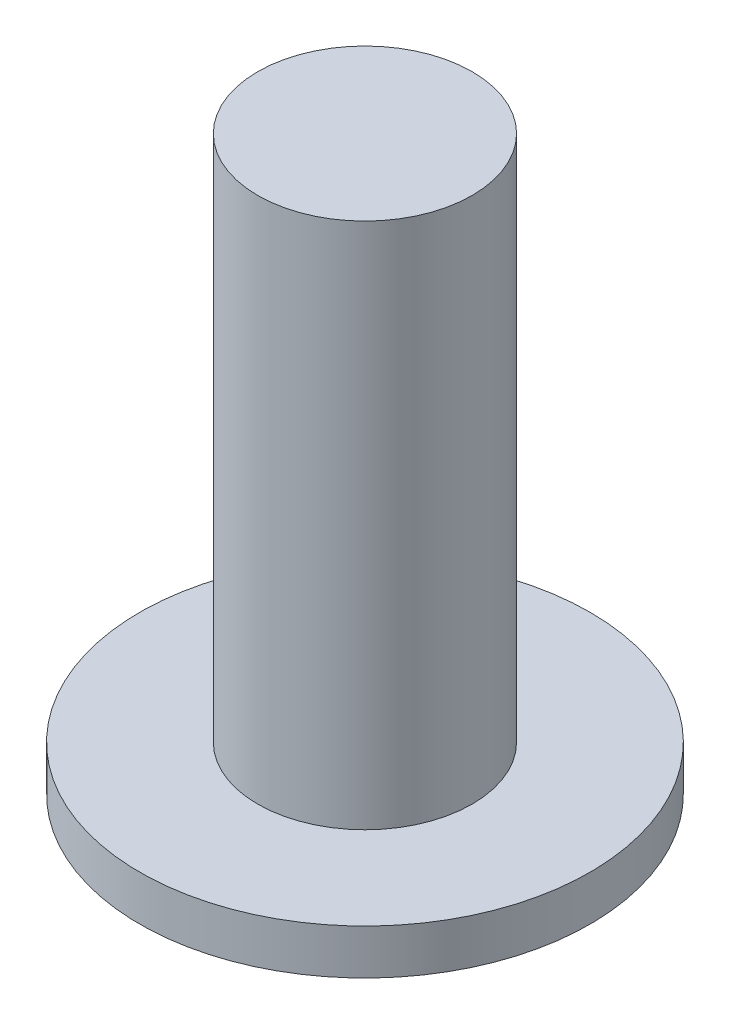
ISO-10303-21;
HEADER;
FILE_DESCRIPTION(('STEP AP214'),'2;1');
FILE_NAME('part.step','',(''),(''),'','','');
FILE_SCHEMA(('AUTOMOTIVE_DESIGN { 1 0 10303 214 1 1 1 1 }'));
ENDSEC;
DATA;
#1=APPLICATION_CONTEXT('core data for automotive mechanical design processes');
#2=APPLICATION_PROTOCOL_DEFINITION('international standard','automotive_design',2000,#1);
#3=PRODUCT_CONTEXT('',#1,'mechanical');
#4=PRODUCT('Part','Part','',(#3));
#5=PRODUCT_RELATED_PRODUCT_CATEGORY('part','',(#4));
#6=PRODUCT_DEFINITION_FORMATION('','',#4);
#7=PRODUCT_DEFINITION_CONTEXT('part definition',#1,'design');
#8=PRODUCT_DEFINITION('design','',#6,#7);
#9=PRODUCT_DEFINITION_SHAPE('','',#8);
#10=(LENGTH_UNIT() NAMED_UNIT(*) SI_UNIT(.MILLI.,.METRE.));
#11=(NAMED_UNIT(*) PLANE_ANGLE_UNIT() SI_UNIT($,.RADIAN.));
#12=(NAMED_UNIT(*) SI_UNIT($,.STERADIAN.) SOLID_ANGLE_UNIT());
#13=UNCERTAINTY_MEASURE_WITH_UNIT(LENGTH_MEASURE(1.E-05),#10,'distance_accuracy_value','');
#14=(GEOMETRIC_REPRESENTATION_CONTEXT(3) GLOBAL_UNCERTAINTY_ASSIGNED_CONTEXT((#13)) GLOBAL_UNIT_ASSIGNED_CONTEXT((#10,
#11,#12)) REPRESENTATION_CONTEXT('',''));
#15=CARTESIAN_POINT('',(0.,0.,0.));
#16=DIRECTION('',(0.,0.,1.));
#17=DIRECTION('',(1.,0.,0.));
#18=AXIS2_PLACEMENT_3D('',#15,#16,#17);
#19=CARTESIAN_POINT('',(0.,-36.8825841816037,0.));
#20=DIRECTION('',(0.,1.,0.));
#21=DIRECTION('',(0.,0.,1.));
#22=AXIS2_PLACEMENT_3D('',#19,#20,#21);
#23=CYLINDRICAL_SURFACE('',#22,4.7625);
#24=CARTESIAN_POINT('',(0.,-23.4122,0.));
#25=DIRECTION('',(0.,-1.,0.));
#26=DIRECTION('',(0.,0.,-1.));
#27=AXIS2_PLACEMENT_3D('',#24,#25,#26);
#28=CIRCLE('',#27,4.7625);
#29=CARTESIAN_POINT('',(0.,-23.4122,-4.7625));
#30=VERTEX_POINT('',#29);
#31=EDGE_CURVE('E10',#30,#30,#28,.F.);
#32=ORIENTED_EDGE('',*,*,#31,.T.);
#33=EDGE_LOOP('',(#32));
#34=FACE_BOUND('',#33,.T.);
#35=CARTESIAN_POINT('',(0.,0.,0.));
#36=DIRECTION('',(0.,1.,0.));
#37=DIRECTION('',(0.,0.,1.));
#38=AXIS2_PLACEMENT_3D('',#35,#36,#37);
#39=CIRCLE('',#38,4.7625);
#40=CARTESIAN_POINT('',(0.,0.,4.7625));
#41=VERTEX_POINT('',#40);
#42=EDGE_CURVE('E46',#41,#41,#39,.T.);
#43=ORIENTED_EDGE('',*,*,#42,.F.);
#44=EDGE_LOOP('',(#43));
#45=FACE_BOUND('',#44,.T.);
#46=ADVANCED_FACE('F32',(#34,#45),#23,.T.);
#47=CARTESIAN_POINT('',(0.,-53.6964712474619,0.));
#48=DIRECTION('',(0.,1.,0.));
#49=DIRECTION('',(0.,0.,1.));
#50=AXIS2_PLACEMENT_3D('',#47,#48,#49);
#51=CYLINDRICAL_SURFACE('',#50,10.);
#52=CARTESIAN_POINT('',(0.,-23.4122,0.));
#53=DIRECTION('',(0.,-1.,0.));
#54=DIRECTION('',(0.,0.,-1.));
#55=AXIS2_PLACEMENT_3D('',#52,#53,#54);
#56=CIRCLE('',#55,10.);
#57=CARTESIAN_POINT('',(0.,-23.4122,-10.));
#58=VERTEX_POINT('',#57);
#59=EDGE_CURVE('E42',#58,#58,#56,.T.);
#60=ORIENTED_EDGE('',*,*,#59,.T.);
#61=EDGE_LOOP('',(#60));
#62=FACE_BOUND('',#61,.T.);
#63=CARTESIAN_POINT('',(0.,-25.4122,0.));
#64=DIRECTION('',(0.,-1.,0.));
#65=DIRECTION('',(0.,0.,-1.));
#66=AXIS2_PLACEMENT_3D('',#63,#64,#65);
#67=CIRCLE('',#66,10.);
#68=CARTESIAN_POINT('',(0.,-25.4122,-10.));
#69=VERTEX_POINT('',#68);
#70=EDGE_CURVE('E38',#69,#69,#67,.T.);
#71=ORIENTED_EDGE('',*,*,#70,.F.);
#72=EDGE_LOOP('',(#71));
#73=FACE_BOUND('',#72,.T.);
#74=ADVANCED_FACE('F55',(#62,#73),#51,.T.);
#75=CARTESIAN_POINT('',(0.,-23.4122,0.));
#76=DIRECTION('',(0.,-1.,0.));
#77=DIRECTION('',(0.,0.,-1.));
#78=AXIS2_PLACEMENT_3D('',#75,#76,#77);
#79=PLANE('',#78);
#80=ORIENTED_EDGE('',*,*,#31,.F.);
#81=EDGE_LOOP('',(#80));
#82=FACE_BOUND('',#81,.T.);
#83=ORIENTED_EDGE('',*,*,#59,.F.);
#84=EDGE_LOOP('',(#83));
#85=FACE_BOUND('',#84,.T.);
#86=ADVANCED_FACE('F59',(#82,#85),#79,.F.);
#87=CARTESIAN_POINT('',(0.,-25.4122,0.));
#88=DIRECTION('',(0.,-1.,0.));
#89=DIRECTION('',(0.,0.,-1.));
#90=AXIS2_PLACEMENT_3D('',#87,#88,#89);
#91=PLANE('',#90);
#92=ORIENTED_EDGE('',*,*,#70,.T.);
#93=EDGE_LOOP('',(#92));
#94=FACE_BOUND('',#93,.T.);
#95=ADVANCED_FACE('F65',(#94),#91,.T.);
#96=CARTESIAN_POINT('',(0.,0.,0.));
#97=DIRECTION('',(0.,1.,0.));
#98=DIRECTION('',(0.,0.,1.));
#99=AXIS2_PLACEMENT_3D('',#96,#97,#98);
#100=PLANE('',#99);
#101=ORIENTED_EDGE('',*,*,#42,.T.);
#102=EDGE_LOOP('',(#101));
#103=FACE_BOUND('',#102,.T.);
#104=ADVANCED_FACE('F52',(#103),#100,.T.);
#105=CLOSED_SHELL('',(#46,#74,#86,#95,#104));
#106=MANIFOLD_SOLID_BREP('B2',#105);
#107=ADVANCED_BREP_SHAPE_REPRESENTATION('',(#18,#106),#14);
#108=SHAPE_DEFINITION_REPRESENTATION(#9,#107);
ENDSEC;
END-ISO-10303-21;
